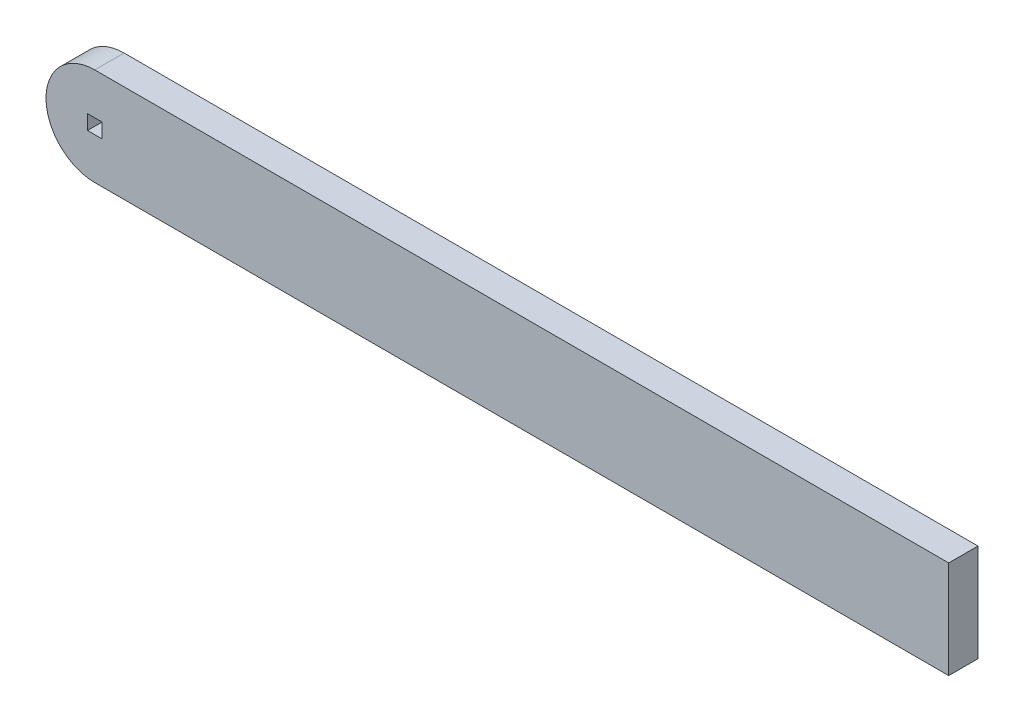
ISO-10303-21;
HEADER;
FILE_DESCRIPTION(('STEP AP214'),'2;1');
FILE_NAME('part.step','',(''),(''),'','','');
FILE_SCHEMA(('AUTOMOTIVE_DESIGN { 1 0 10303 214 1 1 1 1 }'));
ENDSEC;
DATA;
#1=APPLICATION_CONTEXT('core data for automotive mechanical design processes');
#2=APPLICATION_PROTOCOL_DEFINITION('international standard','automotive_design',2000,#1);
#3=PRODUCT_CONTEXT('',#1,'mechanical');
#4=PRODUCT('Part','Part','',(#3));
#5=PRODUCT_RELATED_PRODUCT_CATEGORY('part','',(#4));
#6=PRODUCT_DEFINITION_FORMATION('','',#4);
#7=PRODUCT_DEFINITION_CONTEXT('part definition',#1,'design');
#8=PRODUCT_DEFINITION('design','',#6,#7);
#9=PRODUCT_DEFINITION_SHAPE('','',#8);
#10=(LENGTH_UNIT() NAMED_UNIT(*) SI_UNIT(.MILLI.,.METRE.));
#11=(NAMED_UNIT(*) PLANE_ANGLE_UNIT() SI_UNIT($,.RADIAN.));
#12=(NAMED_UNIT(*) SI_UNIT($,.STERADIAN.) SOLID_ANGLE_UNIT());
#13=UNCERTAINTY_MEASURE_WITH_UNIT(LENGTH_MEASURE(1.E-05),#10,'distance_accuracy_value','');
#14=(GEOMETRIC_REPRESENTATION_CONTEXT(3) GLOBAL_UNCERTAINTY_ASSIGNED_CONTEXT((#13)) GLOBAL_UNIT_ASSIGNED_CONTEXT((#10,
#11,#12)) REPRESENTATION_CONTEXT('',''));
#15=CARTESIAN_POINT('',(0.,0.,0.));
#16=DIRECTION('',(0.,0.,1.));
#17=DIRECTION('',(1.,0.,0.));
#18=AXIS2_PLACEMENT_3D('',#15,#16,#17);
#19=CARTESIAN_POINT('',(0.,0.,6.));
#20=DIRECTION('',(0.,1.,0.));
#21=DIRECTION('',(0.,0.,1.));
#22=AXIS2_PLACEMENT_3D('',#19,#20,#21);
#23=PLANE('',#22);
#24=DIRECTION('',(1.,0.,0.));
#25=VECTOR('',#24,1.);
#26=CARTESIAN_POINT('',(0.,0.,6.));
#27=LINE('',#26,#25);
#28=CARTESIAN_POINT('',(10.,0.,6.));
#29=VERTEX_POINT('',#28);
#30=CARTESIAN_POINT('',(185.,0.,6.));
#31=VERTEX_POINT('',#30);
#32=EDGE_CURVE('E150',#29,#31,#27,.T.);
#33=ORIENTED_EDGE('',*,*,#32,.F.);
#34=DIRECTION('',(0.,0.,-1.));
#35=VECTOR('',#34,1.);
#36=CARTESIAN_POINT('',(10.,0.,6.));
#37=LINE('',#36,#35);
#38=CARTESIAN_POINT('',(10.,0.,0.));
#39=VERTEX_POINT('',#38);
#40=EDGE_CURVE('E167',#29,#39,#37,.T.);
#41=ORIENTED_EDGE('',*,*,#40,.T.);
#42=DIRECTION('',(1.,0.,0.));
#43=VECTOR('',#42,1.);
#44=CARTESIAN_POINT('',(0.,0.,0.));
#45=LINE('',#44,#43);
#46=CARTESIAN_POINT('',(185.,0.,0.));
#47=VERTEX_POINT('',#46);
#48=EDGE_CURVE('E146',#39,#47,#45,.T.);
#49=ORIENTED_EDGE('',*,*,#48,.T.);
#50=DIRECTION('',(0.,0.,-1.));
#51=VECTOR('',#50,1.);
#52=CARTESIAN_POINT('',(185.,0.,6.));
#53=LINE('',#52,#51);
#54=EDGE_CURVE('E164',#31,#47,#53,.T.);
#55=ORIENTED_EDGE('',*,*,#54,.F.);
#56=EDGE_LOOP('',(#33,#41,#49,#55));
#57=FACE_BOUND('',#56,.T.);
#58=ADVANCED_FACE('F34',(#57),#23,.F.);
#59=CARTESIAN_POINT('',(185.,0.,6.));
#60=DIRECTION('',(-1.,0.,0.));
#61=DIRECTION('',(0.,0.,1.));
#62=AXIS2_PLACEMENT_3D('',#59,#60,#61);
#63=PLANE('',#62);
#64=DIRECTION('',(0.,1.,0.));
#65=VECTOR('',#64,1.);
#66=CARTESIAN_POINT('',(185.,0.,0.));
#67=LINE('',#66,#65);
#68=CARTESIAN_POINT('',(185.,20.,0.));
#69=VERTEX_POINT('',#68);
#70=EDGE_CURVE('E159',#47,#69,#67,.T.);
#71=ORIENTED_EDGE('',*,*,#70,.T.);
#72=DIRECTION('',(0.,0.,-1.));
#73=VECTOR('',#72,1.);
#74=CARTESIAN_POINT('',(185.,20.,6.));
#75=LINE('',#74,#73);
#76=CARTESIAN_POINT('',(185.,20.,6.));
#77=VERTEX_POINT('',#76);
#78=EDGE_CURVE('E157',#77,#69,#75,.T.);
#79=ORIENTED_EDGE('',*,*,#78,.F.);
#80=DIRECTION('',(0.,1.,0.));
#81=VECTOR('',#80,1.);
#82=CARTESIAN_POINT('',(185.,0.,6.));
#83=LINE('',#82,#81);
#84=EDGE_CURVE('E152',#31,#77,#83,.T.);
#85=ORIENTED_EDGE('',*,*,#84,.F.);
#86=ORIENTED_EDGE('',*,*,#54,.T.);
#87=EDGE_LOOP('',(#71,#79,#85,#86));
#88=FACE_BOUND('',#87,.T.);
#89=ADVANCED_FACE('F198',(#88),#63,.F.);
#90=CARTESIAN_POINT('',(0.,20.,6.));
#91=DIRECTION('',(0.,-1.,0.));
#92=DIRECTION('',(0.,0.,-1.));
#93=AXIS2_PLACEMENT_3D('',#90,#91,#92);
#94=PLANE('',#93);
#95=DIRECTION('',(-1.,0.,0.));
#96=VECTOR('',#95,1.);
#97=CARTESIAN_POINT('',(0.,20.,0.));
#98=LINE('',#97,#96);
#99=CARTESIAN_POINT('',(10.,20.,0.));
#100=VERTEX_POINT('',#99);
#101=EDGE_CURVE('E153',#69,#100,#98,.T.);
#102=ORIENTED_EDGE('',*,*,#101,.T.);
#103=DIRECTION('',(0.,0.,-1.));
#104=VECTOR('',#103,1.);
#105=CARTESIAN_POINT('',(10.,20.,6.));
#106=LINE('',#105,#104);
#107=CARTESIAN_POINT('',(10.,20.,6.));
#108=VERTEX_POINT('',#107);
#109=EDGE_CURVE('E11',#100,#108,#106,.F.);
#110=ORIENTED_EDGE('',*,*,#109,.T.);
#111=DIRECTION('',(-1.,0.,0.));
#112=VECTOR('',#111,1.);
#113=CARTESIAN_POINT('',(0.,20.,6.));
#114=LINE('',#113,#112);
#115=EDGE_CURVE('E155',#77,#108,#114,.T.);
#116=ORIENTED_EDGE('',*,*,#115,.F.);
#117=ORIENTED_EDGE('',*,*,#78,.T.);
#118=EDGE_LOOP('',(#102,#110,#116,#117));
#119=FACE_BOUND('',#118,.T.);
#120=ADVANCED_FACE('F205',(#119),#94,.F.);
#121=CARTESIAN_POINT('',(0.,0.,6.));
#122=DIRECTION('',(0.,0.,-1.));
#123=DIRECTION('',(-1.,0.,0.));
#124=AXIS2_PLACEMENT_3D('',#121,#122,#123);
#125=PLANE('',#124);
#126=DIRECTION('',(1.,0.,0.));
#127=VECTOR('',#126,1.);
#128=CARTESIAN_POINT('',(8.5,8.5,6.));
#129=LINE('',#128,#127);
#130=CARTESIAN_POINT('',(8.5,8.5,6.));
#131=VERTEX_POINT('',#130);
#132=CARTESIAN_POINT('',(11.5,8.5,6.));
#133=VERTEX_POINT('',#132);
#134=EDGE_CURVE('E140',#131,#133,#129,.T.);
#135=ORIENTED_EDGE('',*,*,#134,.F.);
#136=DIRECTION('',(0.,-1.,0.));
#137=VECTOR('',#136,1.);
#138=CARTESIAN_POINT('',(8.5,11.5,6.));
#139=LINE('',#138,#137);
#140=CARTESIAN_POINT('',(8.5,11.5,6.));
#141=VERTEX_POINT('',#140);
#142=EDGE_CURVE('E113',#141,#131,#139,.T.);
#143=ORIENTED_EDGE('',*,*,#142,.F.);
#144=DIRECTION('',(-1.,0.,0.));
#145=VECTOR('',#144,1.);
#146=CARTESIAN_POINT('',(8.5,11.5,6.));
#147=LINE('',#146,#145);
#148=CARTESIAN_POINT('',(11.5,11.5,6.));
#149=VERTEX_POINT('',#148);
#150=EDGE_CURVE('E131',#149,#141,#147,.T.);
#151=ORIENTED_EDGE('',*,*,#150,.F.);
#152=DIRECTION('',(0.,1.,0.));
#153=VECTOR('',#152,1.);
#154=CARTESIAN_POINT('',(11.5,11.5,6.));
#155=LINE('',#154,#153);
#156=EDGE_CURVE('E134',#133,#149,#155,.T.);
#157=ORIENTED_EDGE('',*,*,#156,.F.);
#158=EDGE_LOOP('',(#135,#143,#151,#157));
#159=FACE_BOUND('',#158,.T.);
#160=CARTESIAN_POINT('',(10.,10.,6.));
#161=DIRECTION('',(0.,0.,-1.));
#162=DIRECTION('',(-1.,0.,0.));
#163=AXIS2_PLACEMENT_3D('',#160,#161,#162);
#164=CIRCLE('',#163,10.);
#165=CARTESIAN_POINT('',(0.,10.,6.));
#166=VERTEX_POINT('',#165);
#167=EDGE_CURVE('E55',#108,#166,#164,.F.);
#168=ORIENTED_EDGE('',*,*,#167,.T.);
#169=CARTESIAN_POINT('',(10.,10.,6.));
#170=DIRECTION('',(0.,0.,-1.));
#171=DIRECTION('',(-1.,0.,0.));
#172=AXIS2_PLACEMENT_3D('',#169,#170,#171);
#173=CIRCLE('',#172,10.);
#174=EDGE_CURVE('E43',#166,#29,#173,.F.);
#175=ORIENTED_EDGE('',*,*,#174,.T.);
#176=ORIENTED_EDGE('',*,*,#32,.T.);
#177=ORIENTED_EDGE('',*,*,#84,.T.);
#178=ORIENTED_EDGE('',*,*,#115,.T.);
#179=EDGE_LOOP('',(#168,#175,#176,#177,#178));
#180=FACE_BOUND('',#179,.T.);
#181=ADVANCED_FACE('F177',(#159,#180),#125,.F.);
#182=CARTESIAN_POINT('',(0.,0.,0.));
#183=DIRECTION('',(0.,0.,-1.));
#184=DIRECTION('',(-1.,0.,0.));
#185=AXIS2_PLACEMENT_3D('',#182,#183,#184);
#186=PLANE('',#185);
#187=DIRECTION('',(0.,-1.,0.));
#188=VECTOR('',#187,1.);
#189=CARTESIAN_POINT('',(8.5,11.5,0.));
#190=LINE('',#189,#188);
#191=CARTESIAN_POINT('',(8.5,11.5,0.));
#192=VERTEX_POINT('',#191);
#193=CARTESIAN_POINT('',(8.5,8.5,0.));
#194=VERTEX_POINT('',#193);
#195=EDGE_CURVE('E110',#192,#194,#190,.T.);
#196=ORIENTED_EDGE('',*,*,#195,.T.);
#197=DIRECTION('',(1.,0.,0.));
#198=VECTOR('',#197,1.);
#199=CARTESIAN_POINT('',(8.5,8.5,0.));
#200=LINE('',#199,#198);
#201=CARTESIAN_POINT('',(11.5,8.5,0.));
#202=VERTEX_POINT('',#201);
#203=EDGE_CURVE('E122',#194,#202,#200,.T.);
#204=ORIENTED_EDGE('',*,*,#203,.T.);
#205=DIRECTION('',(0.,1.,0.));
#206=VECTOR('',#205,1.);
#207=CARTESIAN_POINT('',(11.5,11.5,0.));
#208=LINE('',#207,#206);
#209=CARTESIAN_POINT('',(11.5,11.5,0.));
#210=VERTEX_POINT('',#209);
#211=EDGE_CURVE('E126',#202,#210,#208,.T.);
#212=ORIENTED_EDGE('',*,*,#211,.T.);
#213=DIRECTION('',(-1.,0.,0.));
#214=VECTOR('',#213,1.);
#215=CARTESIAN_POINT('',(8.5,11.5,0.));
#216=LINE('',#215,#214);
#217=EDGE_CURVE('E118',#210,#192,#216,.T.);
#218=ORIENTED_EDGE('',*,*,#217,.T.);
#219=EDGE_LOOP('',(#196,#204,#212,#218));
#220=FACE_BOUND('',#219,.T.);
#221=ORIENTED_EDGE('',*,*,#48,.F.);
#222=CARTESIAN_POINT('',(10.,10.,0.));
#223=DIRECTION('',(0.,0.,-1.));
#224=DIRECTION('',(-1.,0.,0.));
#225=AXIS2_PLACEMENT_3D('',#222,#223,#224);
#226=CIRCLE('',#225,10.);
#227=CARTESIAN_POINT('',(0.,10.,0.));
#228=VERTEX_POINT('',#227);
#229=EDGE_CURVE('E172',#39,#228,#226,.T.);
#230=ORIENTED_EDGE('',*,*,#229,.T.);
#231=CARTESIAN_POINT('',(10.,10.,0.));
#232=DIRECTION('',(0.,0.,-1.));
#233=DIRECTION('',(-1.,0.,0.));
#234=AXIS2_PLACEMENT_3D('',#231,#232,#233);
#235=CIRCLE('',#234,10.);
#236=EDGE_CURVE('E170',#228,#100,#235,.T.);
#237=ORIENTED_EDGE('',*,*,#236,.T.);
#238=ORIENTED_EDGE('',*,*,#101,.F.);
#239=ORIENTED_EDGE('',*,*,#70,.F.);
#240=EDGE_LOOP('',(#221,#230,#237,#238,#239));
#241=FACE_BOUND('',#240,.T.);
#242=ADVANCED_FACE('F128',(#220,#241),#186,.T.);
#243=CARTESIAN_POINT('',(8.5,11.5,0.));
#244=DIRECTION('',(-1.,0.,0.));
#245=DIRECTION('',(0.,0.,1.));
#246=AXIS2_PLACEMENT_3D('',#243,#244,#245);
#247=PLANE('',#246);
#248=ORIENTED_EDGE('',*,*,#142,.T.);
#249=DIRECTION('',(0.,0.,1.));
#250=VECTOR('',#249,1.);
#251=CARTESIAN_POINT('',(8.5,8.5,0.));
#252=LINE('',#251,#250);
#253=EDGE_CURVE('E106',#194,#131,#252,.T.);
#254=ORIENTED_EDGE('',*,*,#253,.F.);
#255=ORIENTED_EDGE('',*,*,#195,.F.);
#256=DIRECTION('',(0.,0.,1.));
#257=VECTOR('',#256,1.);
#258=CARTESIAN_POINT('',(8.5,11.5,0.));
#259=LINE('',#258,#257);
#260=EDGE_CURVE('E144',#192,#141,#259,.T.);
#261=ORIENTED_EDGE('',*,*,#260,.T.);
#262=EDGE_LOOP('',(#248,#254,#255,#261));
#263=FACE_BOUND('',#262,.T.);
#264=ADVANCED_FACE('F108',(#263),#247,.F.);
#265=CARTESIAN_POINT('',(8.5,11.5,0.));
#266=DIRECTION('',(0.,1.,0.));
#267=DIRECTION('',(0.,0.,1.));
#268=AXIS2_PLACEMENT_3D('',#265,#266,#267);
#269=PLANE('',#268);
#270=ORIENTED_EDGE('',*,*,#150,.T.);
#271=ORIENTED_EDGE('',*,*,#260,.F.);
#272=ORIENTED_EDGE('',*,*,#217,.F.);
#273=DIRECTION('',(0.,0.,1.));
#274=VECTOR('',#273,1.);
#275=CARTESIAN_POINT('',(11.5,11.5,0.));
#276=LINE('',#275,#274);
#277=EDGE_CURVE('E147',#210,#149,#276,.T.);
#278=ORIENTED_EDGE('',*,*,#277,.T.);
#279=EDGE_LOOP('',(#270,#271,#272,#278));
#280=FACE_BOUND('',#279,.T.);
#281=ADVANCED_FACE('F216',(#280),#269,.F.);
#282=CARTESIAN_POINT('',(11.5,11.5,0.));
#283=DIRECTION('',(1.,0.,0.));
#284=DIRECTION('',(0.,0.,-1.));
#285=AXIS2_PLACEMENT_3D('',#282,#283,#284);
#286=PLANE('',#285);
#287=ORIENTED_EDGE('',*,*,#156,.T.);
#288=ORIENTED_EDGE('',*,*,#277,.F.);
#289=ORIENTED_EDGE('',*,*,#211,.F.);
#290=DIRECTION('',(0.,0.,1.));
#291=VECTOR('',#290,1.);
#292=CARTESIAN_POINT('',(11.5,8.5,0.));
#293=LINE('',#292,#291);
#294=EDGE_CURVE('E117',#202,#133,#293,.T.);
#295=ORIENTED_EDGE('',*,*,#294,.T.);
#296=EDGE_LOOP('',(#287,#288,#289,#295));
#297=FACE_BOUND('',#296,.T.);
#298=ADVANCED_FACE('F195',(#297),#286,.F.);
#299=CARTESIAN_POINT('',(8.5,8.5,0.));
#300=DIRECTION('',(0.,-1.,0.));
#301=DIRECTION('',(0.,0.,-1.));
#302=AXIS2_PLACEMENT_3D('',#299,#300,#301);
#303=PLANE('',#302);
#304=ORIENTED_EDGE('',*,*,#134,.T.);
#305=ORIENTED_EDGE('',*,*,#294,.F.);
#306=ORIENTED_EDGE('',*,*,#203,.F.);
#307=ORIENTED_EDGE('',*,*,#253,.T.);
#308=EDGE_LOOP('',(#304,#305,#306,#307));
#309=FACE_BOUND('',#308,.T.);
#310=ADVANCED_FACE('F123',(#309),#303,.F.);
#311=CARTESIAN_POINT('',(10.,10.,6.));
#312=DIRECTION('',(0.,0.,-1.));
#313=DIRECTION('',(-1.,0.,0.));
#314=AXIS2_PLACEMENT_3D('',#311,#312,#313);
#315=CYLINDRICAL_SURFACE('',#314,10.);
#316=DIRECTION('',(0.,0.,-1.));
#317=VECTOR('',#316,1.);
#318=CARTESIAN_POINT('',(0.,10.,6.));
#319=LINE('',#318,#317);
#320=EDGE_CURVE('E38',#166,#228,#319,.T.);
#321=ORIENTED_EDGE('',*,*,#320,.F.);
#322=ORIENTED_EDGE('',*,*,#167,.F.);
#323=ORIENTED_EDGE('',*,*,#109,.F.);
#324=ORIENTED_EDGE('',*,*,#236,.F.);
#325=EDGE_LOOP('',(#321,#322,#323,#324));
#326=FACE_BOUND('',#325,.T.);
#327=ADVANCED_FACE('F36',(#326),#315,.T.);
#328=CARTESIAN_POINT('',(10.,10.,6.));
#329=DIRECTION('',(0.,0.,-1.));
#330=DIRECTION('',(-1.,0.,0.));
#331=AXIS2_PLACEMENT_3D('',#328,#329,#330);
#332=CYLINDRICAL_SURFACE('',#331,10.);
#333=ORIENTED_EDGE('',*,*,#174,.F.);
#334=ORIENTED_EDGE('',*,*,#320,.T.);
#335=ORIENTED_EDGE('',*,*,#229,.F.);
#336=ORIENTED_EDGE('',*,*,#40,.F.);
#337=EDGE_LOOP('',(#333,#334,#335,#336));
#338=FACE_BOUND('',#337,.T.);
#339=ADVANCED_FACE('F185',(#338),#332,.T.);
#340=CLOSED_SHELL('',(#58,#89,#120,#181,#242,#264,#281,#298,#310,#327,#339));
#341=MANIFOLD_SOLID_BREP('B2',#340);
#342=ADVANCED_BREP_SHAPE_REPRESENTATION('',(#18,#341),#14);
#343=SHAPE_DEFINITION_REPRESENTATION(#9,#342);
ENDSEC;
END-ISO-10303-21;
